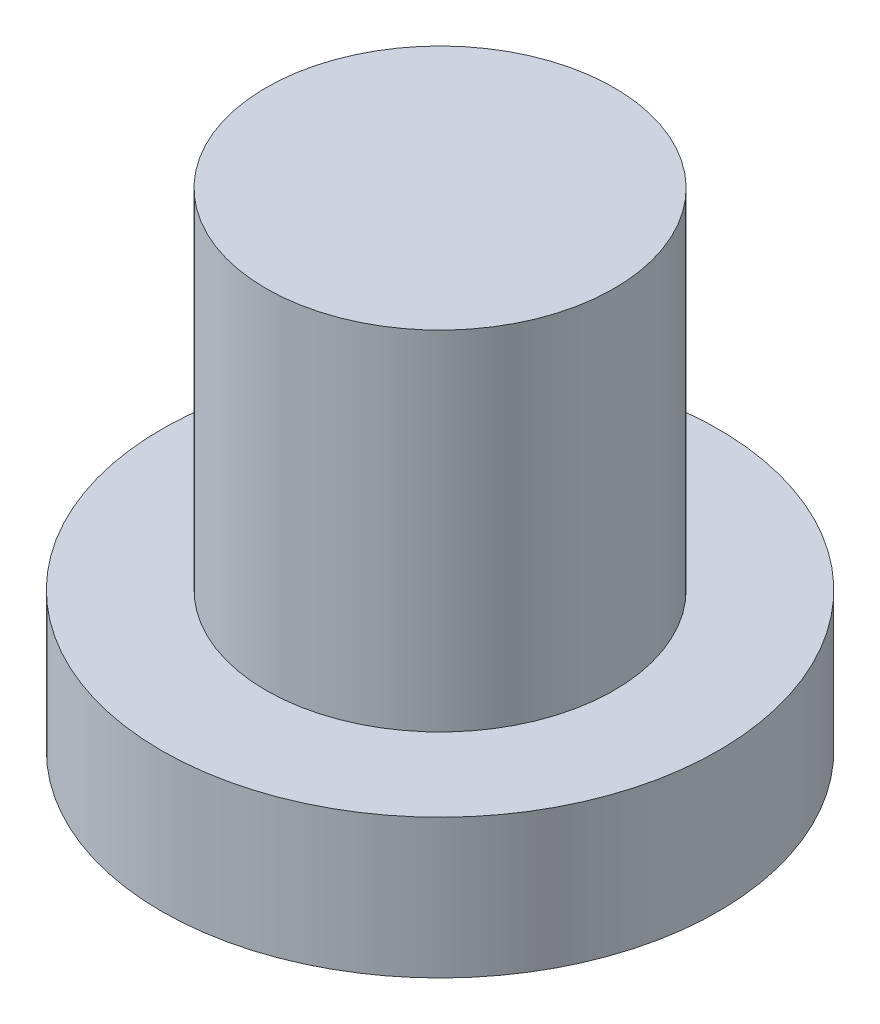
ISO-10303-21;
HEADER;
FILE_DESCRIPTION(('STEP AP214'),'2;1');
FILE_NAME('part.step','',(''),(''),'','','');
FILE_SCHEMA(('AUTOMOTIVE_DESIGN { 1 0 10303 214 1 1 1 1 }'));
ENDSEC;
DATA;
#1=APPLICATION_CONTEXT('core data for automotive mechanical design processes');
#2=APPLICATION_PROTOCOL_DEFINITION('international standard','automotive_design',2000,#1);
#3=PRODUCT_CONTEXT('',#1,'mechanical');
#4=PRODUCT('Part','Part','',(#3));
#5=PRODUCT_RELATED_PRODUCT_CATEGORY('part','',(#4));
#6=PRODUCT_DEFINITION_FORMATION('','',#4);
#7=PRODUCT_DEFINITION_CONTEXT('part definition',#1,'design');
#8=PRODUCT_DEFINITION('design','',#6,#7);
#9=PRODUCT_DEFINITION_SHAPE('','',#8);
#10=(LENGTH_UNIT() NAMED_UNIT(*) SI_UNIT(.MILLI.,.METRE.));
#11=(NAMED_UNIT(*) PLANE_ANGLE_UNIT() SI_UNIT($,.RADIAN.));
#12=(NAMED_UNIT(*) SI_UNIT($,.STERADIAN.) SOLID_ANGLE_UNIT());
#13=UNCERTAINTY_MEASURE_WITH_UNIT(LENGTH_MEASURE(1.E-05),#10,'distance_accuracy_value','');
#14=(GEOMETRIC_REPRESENTATION_CONTEXT(3) GLOBAL_UNCERTAINTY_ASSIGNED_CONTEXT((#13)) GLOBAL_UNIT_ASSIGNED_CONTEXT((#10,
#11,#12)) REPRESENTATION_CONTEXT('',''));
#15=CARTESIAN_POINT('',(0.,0.,0.));
#16=DIRECTION('',(0.,0.,1.));
#17=DIRECTION('',(1.,0.,0.));
#18=AXIS2_PLACEMENT_3D('',#15,#16,#17);
#19=CARTESIAN_POINT('',(0.,20.,0.));
#20=DIRECTION('',(0.,-1.,0.));
#21=DIRECTION('',(0.,0.,-1.));
#22=AXIS2_PLACEMENT_3D('',#19,#20,#21);
#23=CYLINDRICAL_SURFACE('',#22,40.);
#24=CARTESIAN_POINT('',(0.,20.,0.));
#25=DIRECTION('',(0.,1.,0.));
#26=DIRECTION('',(0.,0.,1.));
#27=AXIS2_PLACEMENT_3D('',#24,#25,#26);
#28=CIRCLE('',#27,40.);
#29=CARTESIAN_POINT('',(0.,20.,40.));
#30=VERTEX_POINT('',#29);
#31=EDGE_CURVE('E44',#30,#30,#28,.T.);
#32=ORIENTED_EDGE('',*,*,#31,.F.);
#33=EDGE_LOOP('',(#32));
#34=FACE_BOUND('',#33,.T.);
#35=CARTESIAN_POINT('',(0.,0.,0.));
#36=DIRECTION('',(0.,1.,0.));
#37=DIRECTION('',(0.,0.,1.));
#38=AXIS2_PLACEMENT_3D('',#35,#36,#37);
#39=CIRCLE('',#38,40.);
#40=CARTESIAN_POINT('',(0.,0.,40.));
#41=VERTEX_POINT('',#40);
#42=EDGE_CURVE('E40',#41,#41,#39,.T.);
#43=ORIENTED_EDGE('',*,*,#42,.T.);
#44=EDGE_LOOP('',(#43));
#45=FACE_BOUND('',#44,.T.);
#46=ADVANCED_FACE('F37',(#34,#45),#23,.T.);
#47=CARTESIAN_POINT('',(0.,20.,0.));
#48=DIRECTION('',(0.,1.,0.));
#49=DIRECTION('',(0.,0.,1.));
#50=AXIS2_PLACEMENT_3D('',#47,#48,#49);
#51=PLANE('',#50);
#52=CARTESIAN_POINT('',(0.,20.,0.));
#53=DIRECTION('',(0.,1.,0.));
#54=DIRECTION('',(0.,0.,1.));
#55=AXIS2_PLACEMENT_3D('',#52,#53,#54);
#56=CIRCLE('',#55,25.);
#57=CARTESIAN_POINT('',(0.,20.,25.));
#58=VERTEX_POINT('',#57);
#59=EDGE_CURVE('E10',#58,#58,#56,.T.);
#60=ORIENTED_EDGE('',*,*,#59,.F.);
#61=EDGE_LOOP('',(#60));
#62=FACE_BOUND('',#61,.T.);
#63=ORIENTED_EDGE('',*,*,#31,.T.);
#64=EDGE_LOOP('',(#63));
#65=FACE_BOUND('',#64,.T.);
#66=ADVANCED_FACE('F61',(#62,#65),#51,.T.);
#67=CARTESIAN_POINT('',(0.,0.,0.));
#68=DIRECTION('',(0.,1.,0.));
#69=DIRECTION('',(0.,0.,1.));
#70=AXIS2_PLACEMENT_3D('',#67,#68,#69);
#71=PLANE('',#70);
#72=ORIENTED_EDGE('',*,*,#42,.F.);
#73=EDGE_LOOP('',(#72));
#74=FACE_BOUND('',#73,.T.);
#75=ADVANCED_FACE('F58',(#74),#71,.F.);
#76=CARTESIAN_POINT('',(0.,70.,0.));
#77=DIRECTION('',(0.,-1.,0.));
#78=DIRECTION('',(0.,0.,-1.));
#79=AXIS2_PLACEMENT_3D('',#76,#77,#78);
#80=CYLINDRICAL_SURFACE('',#79,25.);
#81=CARTESIAN_POINT('',(0.,70.,0.));
#82=DIRECTION('',(0.,1.,0.));
#83=DIRECTION('',(0.,0.,1.));
#84=AXIS2_PLACEMENT_3D('',#81,#82,#83);
#85=CIRCLE('',#84,25.);
#86=CARTESIAN_POINT('',(0.,70.,25.));
#87=VERTEX_POINT('',#86);
#88=EDGE_CURVE('E50',#87,#87,#85,.T.);
#89=ORIENTED_EDGE('',*,*,#88,.F.);
#90=EDGE_LOOP('',(#89));
#91=FACE_BOUND('',#90,.T.);
#92=ORIENTED_EDGE('',*,*,#59,.T.);
#93=EDGE_LOOP('',(#92));
#94=FACE_BOUND('',#93,.T.);
#95=ADVANCED_FACE('F60',(#91,#94),#80,.T.);
#96=CARTESIAN_POINT('',(0.,70.,0.));
#97=DIRECTION('',(0.,1.,0.));
#98=DIRECTION('',(0.,0.,1.));
#99=AXIS2_PLACEMENT_3D('',#96,#97,#98);
#100=PLANE('',#99);
#101=ORIENTED_EDGE('',*,*,#88,.T.);
#102=EDGE_LOOP('',(#101));
#103=FACE_BOUND('',#102,.T.);
#104=ADVANCED_FACE('F67',(#103),#100,.T.);
#105=CLOSED_SHELL('',(#46,#66,#75,#95,#104));
#106=MANIFOLD_SOLID_BREP('B2',#105);
#107=ADVANCED_BREP_SHAPE_REPRESENTATION('',(#18,#106),#14);
#108=SHAPE_DEFINITION_REPRESENTATION(#9,#107);
ENDSEC;
END-ISO-10303-21;
